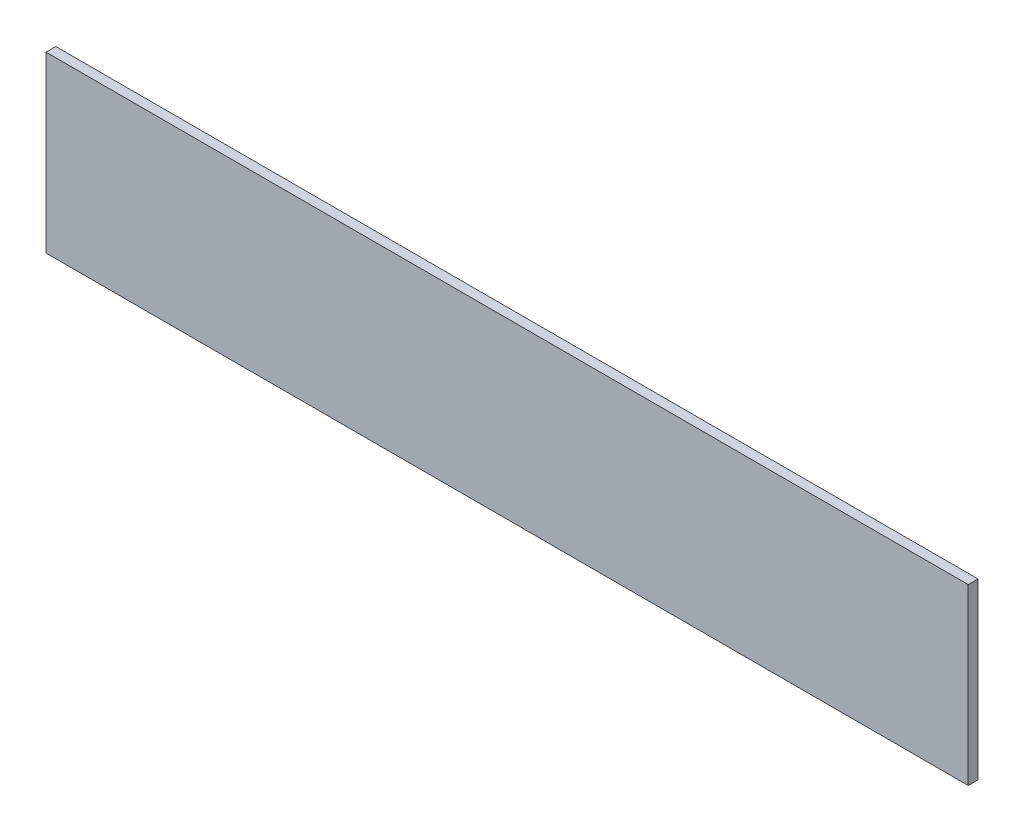
ISO-10303-21;
HEADER;
FILE_DESCRIPTION(('STEP AP214'),'2;1');
FILE_NAME('part.step','',(''),(''),'','','');
FILE_SCHEMA(('AUTOMOTIVE_DESIGN { 1 0 10303 214 1 1 1 1 }'));
ENDSEC;
DATA;
#1=APPLICATION_CONTEXT('core data for automotive mechanical design processes');
#2=APPLICATION_PROTOCOL_DEFINITION('international standard','automotive_design',2000,#1);
#3=PRODUCT_CONTEXT('',#1,'mechanical');
#4=PRODUCT('Part','Part','',(#3));
#5=PRODUCT_RELATED_PRODUCT_CATEGORY('part','',(#4));
#6=PRODUCT_DEFINITION_FORMATION('','',#4);
#7=PRODUCT_DEFINITION_CONTEXT('part definition',#1,'design');
#8=PRODUCT_DEFINITION('design','',#6,#7);
#9=PRODUCT_DEFINITION_SHAPE('','',#8);
#10=(LENGTH_UNIT() NAMED_UNIT(*) SI_UNIT(.MILLI.,.METRE.));
#11=(NAMED_UNIT(*) PLANE_ANGLE_UNIT() SI_UNIT($,.RADIAN.));
#12=(NAMED_UNIT(*) SI_UNIT($,.STERADIAN.) SOLID_ANGLE_UNIT());
#13=UNCERTAINTY_MEASURE_WITH_UNIT(LENGTH_MEASURE(1.E-05),#10,'distance_accuracy_value','');
#14=(GEOMETRIC_REPRESENTATION_CONTEXT(3) GLOBAL_UNCERTAINTY_ASSIGNED_CONTEXT((#13)) GLOBAL_UNIT_ASSIGNED_CONTEXT((#10,
#11,#12)) REPRESENTATION_CONTEXT('',''));
#15=CARTESIAN_POINT('',(0.,0.,0.));
#16=DIRECTION('',(0.,0.,1.));
#17=DIRECTION('',(1.,0.,0.));
#18=AXIS2_PLACEMENT_3D('',#15,#16,#17);
#19=CARTESIAN_POINT('',(149.85,28.275,3.175));
#20=DIRECTION('',(-1.,0.,0.));
#21=DIRECTION('',(0.,0.,1.));
#22=AXIS2_PLACEMENT_3D('',#19,#20,#21);
#23=PLANE('',#22);
#24=DIRECTION('',(0.,1.,0.));
#25=VECTOR('',#24,1.);
#26=CARTESIAN_POINT('',(149.85,28.275,0.));
#27=LINE('',#26,#25);
#28=CARTESIAN_POINT('',(149.85,-28.275,0.));
#29=VERTEX_POINT('',#28);
#30=CARTESIAN_POINT('',(149.85,28.275,0.));
#31=VERTEX_POINT('',#30);
#32=EDGE_CURVE('E100',#29,#31,#27,.T.);
#33=ORIENTED_EDGE('',*,*,#32,.T.);
#34=DIRECTION('',(0.,0.,-1.));
#35=VECTOR('',#34,1.);
#36=CARTESIAN_POINT('',(149.85,28.275,3.175));
#37=LINE('',#36,#35);
#38=CARTESIAN_POINT('',(149.85,28.275,3.175));
#39=VERTEX_POINT('',#38);
#40=EDGE_CURVE('E11',#39,#31,#37,.T.);
#41=ORIENTED_EDGE('',*,*,#40,.F.);
#42=DIRECTION('',(0.,1.,0.));
#43=VECTOR('',#42,1.);
#44=CARTESIAN_POINT('',(149.85,28.275,3.175));
#45=LINE('',#44,#43);
#46=CARTESIAN_POINT('',(149.85,-28.275,3.175));
#47=VERTEX_POINT('',#46);
#48=EDGE_CURVE('E88',#47,#39,#45,.T.);
#49=ORIENTED_EDGE('',*,*,#48,.F.);
#50=DIRECTION('',(0.,0.,-1.));
#51=VECTOR('',#50,1.);
#52=CARTESIAN_POINT('',(149.85,-28.275,3.175));
#53=LINE('',#52,#51);
#54=EDGE_CURVE('E96',#47,#29,#53,.T.);
#55=ORIENTED_EDGE('',*,*,#54,.T.);
#56=EDGE_LOOP('',(#33,#41,#49,#55));
#57=FACE_BOUND('',#56,.T.);
#58=ADVANCED_FACE('F37',(#57),#23,.F.);
#59=CARTESIAN_POINT('',(-149.85,28.275,3.175));
#60=DIRECTION('',(0.,-1.,0.));
#61=DIRECTION('',(0.,0.,-1.));
#62=AXIS2_PLACEMENT_3D('',#59,#60,#61);
#63=PLANE('',#62);
#64=DIRECTION('',(-1.,0.,0.));
#65=VECTOR('',#64,1.);
#66=CARTESIAN_POINT('',(-149.85,28.275,0.));
#67=LINE('',#66,#65);
#68=CARTESIAN_POINT('',(-149.85,28.275,0.));
#69=VERTEX_POINT('',#68);
#70=EDGE_CURVE('E92',#31,#69,#67,.T.);
#71=ORIENTED_EDGE('',*,*,#70,.T.);
#72=DIRECTION('',(0.,0.,-1.));
#73=VECTOR('',#72,1.);
#74=CARTESIAN_POINT('',(-149.85,28.275,3.175));
#75=LINE('',#74,#73);
#76=CARTESIAN_POINT('',(-149.85,28.275,3.175));
#77=VERTEX_POINT('',#76);
#78=EDGE_CURVE('E45',#77,#69,#75,.T.);
#79=ORIENTED_EDGE('',*,*,#78,.F.);
#80=DIRECTION('',(-1.,0.,0.));
#81=VECTOR('',#80,1.);
#82=CARTESIAN_POINT('',(-149.85,28.275,3.175));
#83=LINE('',#82,#81);
#84=EDGE_CURVE('E83',#39,#77,#83,.T.);
#85=ORIENTED_EDGE('',*,*,#84,.F.);
#86=ORIENTED_EDGE('',*,*,#40,.T.);
#87=EDGE_LOOP('',(#71,#79,#85,#86));
#88=FACE_BOUND('',#87,.T.);
#89=ADVANCED_FACE('F91',(#88),#63,.F.);
#90=CARTESIAN_POINT('',(-149.85,28.275,3.175));
#91=DIRECTION('',(1.,0.,0.));
#92=DIRECTION('',(0.,0.,-1.));
#93=AXIS2_PLACEMENT_3D('',#90,#91,#92);
#94=PLANE('',#93);
#95=DIRECTION('',(0.,-1.,0.));
#96=VECTOR('',#95,1.);
#97=CARTESIAN_POINT('',(-149.85,28.275,0.));
#98=LINE('',#97,#96);
#99=CARTESIAN_POINT('',(-149.85,-28.275,0.));
#100=VERTEX_POINT('',#99);
#101=EDGE_CURVE('E70',#69,#100,#98,.T.);
#102=ORIENTED_EDGE('',*,*,#101,.T.);
#103=DIRECTION('',(0.,0.,-1.));
#104=VECTOR('',#103,1.);
#105=CARTESIAN_POINT('',(-149.85,-28.275,3.175));
#106=LINE('',#105,#104);
#107=CARTESIAN_POINT('',(-149.85,-28.275,3.175));
#108=VERTEX_POINT('',#107);
#109=EDGE_CURVE('E93',#108,#100,#106,.T.);
#110=ORIENTED_EDGE('',*,*,#109,.F.);
#111=DIRECTION('',(0.,-1.,0.));
#112=VECTOR('',#111,1.);
#113=CARTESIAN_POINT('',(-149.85,28.275,3.175));
#114=LINE('',#113,#112);
#115=EDGE_CURVE('E86',#77,#108,#114,.T.);
#116=ORIENTED_EDGE('',*,*,#115,.F.);
#117=ORIENTED_EDGE('',*,*,#78,.T.);
#118=EDGE_LOOP('',(#102,#110,#116,#117));
#119=FACE_BOUND('',#118,.T.);
#120=ADVANCED_FACE('F94',(#119),#94,.F.);
#121=CARTESIAN_POINT('',(-149.85,-28.275,3.175));
#122=DIRECTION('',(0.,1.,0.));
#123=DIRECTION('',(0.,0.,1.));
#124=AXIS2_PLACEMENT_3D('',#121,#122,#123);
#125=PLANE('',#124);
#126=DIRECTION('',(1.,0.,0.));
#127=VECTOR('',#126,1.);
#128=CARTESIAN_POINT('',(-149.85,-28.275,0.));
#129=LINE('',#128,#127);
#130=EDGE_CURVE('E76',#100,#29,#129,.T.);
#131=ORIENTED_EDGE('',*,*,#130,.T.);
#132=ORIENTED_EDGE('',*,*,#54,.F.);
#133=DIRECTION('',(1.,0.,0.));
#134=VECTOR('',#133,1.);
#135=CARTESIAN_POINT('',(-149.85,-28.275,3.175));
#136=LINE('',#135,#134);
#137=EDGE_CURVE('E53',#108,#47,#136,.T.);
#138=ORIENTED_EDGE('',*,*,#137,.F.);
#139=ORIENTED_EDGE('',*,*,#109,.T.);
#140=EDGE_LOOP('',(#131,#132,#138,#139));
#141=FACE_BOUND('',#140,.T.);
#142=ADVANCED_FACE('F107',(#141),#125,.F.);
#143=CARTESIAN_POINT('',(0.,0.,3.175));
#144=DIRECTION('',(0.,0.,1.));
#145=DIRECTION('',(1.,0.,0.));
#146=AXIS2_PLACEMENT_3D('',#143,#144,#145);
#147=PLANE('',#146);
#148=ORIENTED_EDGE('',*,*,#48,.T.);
#149=ORIENTED_EDGE('',*,*,#84,.T.);
#150=ORIENTED_EDGE('',*,*,#115,.T.);
#151=ORIENTED_EDGE('',*,*,#137,.T.);
#152=EDGE_LOOP('',(#148,#149,#150,#151));
#153=FACE_BOUND('',#152,.T.);
#154=ADVANCED_FACE('F84',(#153),#147,.T.);
#155=CARTESIAN_POINT('',(0.,0.,0.));
#156=DIRECTION('',(0.,0.,1.));
#157=DIRECTION('',(1.,0.,0.));
#158=AXIS2_PLACEMENT_3D('',#155,#156,#157);
#159=PLANE('',#158);
#160=ORIENTED_EDGE('',*,*,#32,.F.);
#161=ORIENTED_EDGE('',*,*,#130,.F.);
#162=ORIENTED_EDGE('',*,*,#101,.F.);
#163=ORIENTED_EDGE('',*,*,#70,.F.);
#164=EDGE_LOOP('',(#160,#161,#162,#163));
#165=FACE_BOUND('',#164,.T.);
#166=ADVANCED_FACE('F110',(#165),#159,.F.);
#167=CLOSED_SHELL('',(#58,#89,#120,#142,#154,#166));
#168=MANIFOLD_SOLID_BREP('B2',#167);
#169=ADVANCED_BREP_SHAPE_REPRESENTATION('',(#18,#168),#14);
#170=SHAPE_DEFINITION_REPRESENTATION(#9,#169);
ENDSEC;
END-ISO-10303-21;
